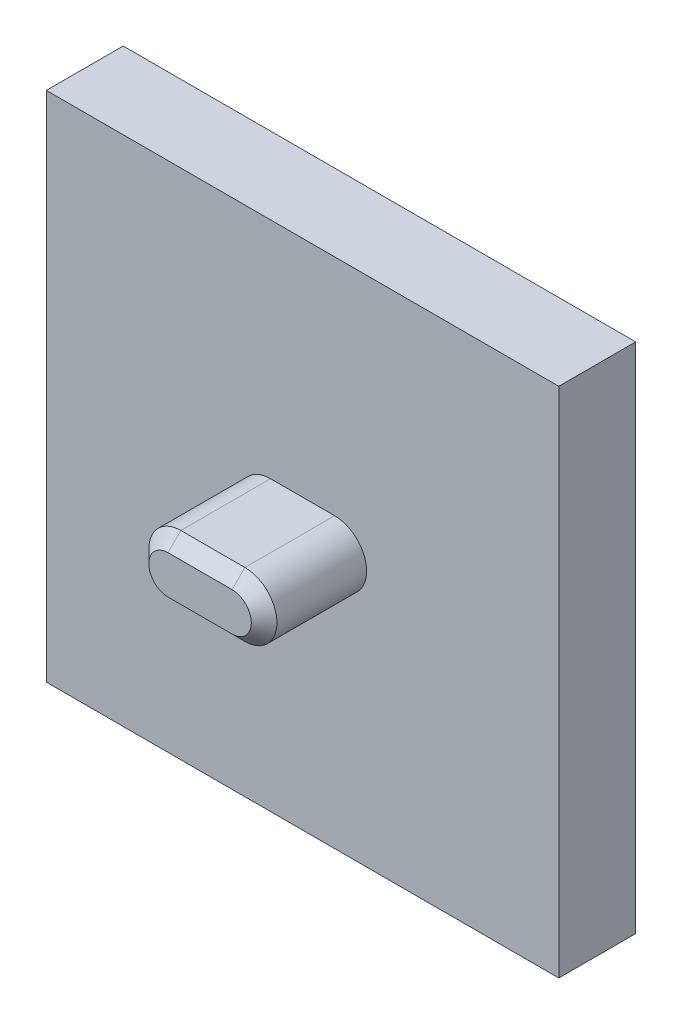
ISO-10303-21;
HEADER;
FILE_DESCRIPTION(('STEP AP214'),'2;1');
FILE_NAME('part.step','',(''),(''),'','','');
FILE_SCHEMA(('AUTOMOTIVE_DESIGN { 1 0 10303 214 1 1 1 1 }'));
ENDSEC;
DATA;
#1=APPLICATION_CONTEXT('core data for automotive mechanical design processes');
#2=APPLICATION_PROTOCOL_DEFINITION('international standard','automotive_design',2000,#1);
#3=PRODUCT_CONTEXT('',#1,'mechanical');
#4=PRODUCT('Part','Part','',(#3));
#5=PRODUCT_RELATED_PRODUCT_CATEGORY('part','',(#4));
#6=PRODUCT_DEFINITION_FORMATION('','',#4);
#7=PRODUCT_DEFINITION_CONTEXT('part definition',#1,'design');
#8=PRODUCT_DEFINITION('design','',#6,#7);
#9=PRODUCT_DEFINITION_SHAPE('','',#8);
#10=(LENGTH_UNIT() NAMED_UNIT(*) SI_UNIT(.MILLI.,.METRE.));
#11=(NAMED_UNIT(*) PLANE_ANGLE_UNIT() SI_UNIT($,.RADIAN.));
#12=(NAMED_UNIT(*) SI_UNIT($,.STERADIAN.) SOLID_ANGLE_UNIT());
#13=UNCERTAINTY_MEASURE_WITH_UNIT(LENGTH_MEASURE(1.E-05),#10,'distance_accuracy_value','');
#14=(GEOMETRIC_REPRESENTATION_CONTEXT(3) GLOBAL_UNCERTAINTY_ASSIGNED_CONTEXT((#13)) GLOBAL_UNIT_ASSIGNED_CONTEXT((#10,
#11,#12)) REPRESENTATION_CONTEXT('',''));
#15=CARTESIAN_POINT('',(0.,0.,0.));
#16=DIRECTION('',(0.,0.,1.));
#17=DIRECTION('',(1.,0.,0.));
#18=AXIS2_PLACEMENT_3D('',#15,#16,#17);
#19=CARTESIAN_POINT('',(10.,10.,0.));
#20=DIRECTION('',(0.,0.,1.));
#21=DIRECTION('',(1.,0.,0.));
#22=AXIS2_PLACEMENT_3D('',#19,#20,#21);
#23=PLANE('',#22);
#24=DIRECTION('',(0.,-1.,0.));
#25=VECTOR('',#24,1.);
#26=CARTESIAN_POINT('',(0.,20.,0.));
#27=LINE('',#26,#25);
#28=CARTESIAN_POINT('',(0.,20.,0.));
#29=VERTEX_POINT('',#28);
#30=CARTESIAN_POINT('',(0.,0.,0.));
#31=VERTEX_POINT('',#30);
#32=EDGE_CURVE('E24',#29,#31,#27,.T.);
#33=ORIENTED_EDGE('',*,*,#32,.F.);
#34=DIRECTION('',(-1.,0.,0.));
#35=VECTOR('',#34,1.);
#36=CARTESIAN_POINT('',(20.,20.,0.));
#37=LINE('',#36,#35);
#38=CARTESIAN_POINT('',(20.,20.,0.));
#39=VERTEX_POINT('',#38);
#40=EDGE_CURVE('E94',#39,#29,#37,.T.);
#41=ORIENTED_EDGE('',*,*,#40,.F.);
#42=DIRECTION('',(0.,1.,0.));
#43=VECTOR('',#42,1.);
#44=CARTESIAN_POINT('',(20.,0.,0.));
#45=LINE('',#44,#43);
#46=CARTESIAN_POINT('',(20.,0.,0.));
#47=VERTEX_POINT('',#46);
#48=EDGE_CURVE('E87',#47,#39,#45,.T.);
#49=ORIENTED_EDGE('',*,*,#48,.F.);
#50=DIRECTION('',(1.,0.,0.));
#51=VECTOR('',#50,1.);
#52=CARTESIAN_POINT('',(0.,0.,0.));
#53=LINE('',#52,#51);
#54=EDGE_CURVE('E71',#31,#47,#53,.T.);
#55=ORIENTED_EDGE('',*,*,#54,.F.);
#56=EDGE_LOOP('',(#33,#41,#49,#55));
#57=FACE_BOUND('',#56,.T.);
#58=ADVANCED_FACE('F16',(#57),#23,.F.);
#59=CARTESIAN_POINT('',(10.,10.,3.));
#60=DIRECTION('',(0.,0.,1.));
#61=DIRECTION('',(1.,0.,0.));
#62=AXIS2_PLACEMENT_3D('',#59,#60,#61);
#63=PLANE('',#62);
#64=DIRECTION('',(-0.9999999692097,0.0002481543853891,0.));
#65=VECTOR('',#64,1.);
#66=CARTESIAN_POINT('',(9.35500210703819,8.75047015768469,3.));
#67=LINE('',#66,#65);
#68=CARTESIAN_POINT('',(11.2496898070044,8.74999998260853,3.));
#69=VERTEX_POINT('',#68);
#70=CARTESIAN_POINT('',(8.71031433009622,8.75063013978868,3.));
#71=VERTEX_POINT('',#70);
#72=EDGE_CURVE('E138',#69,#71,#67,.T.);
#73=ORIENTED_EDGE('',*,*,#72,.T.);
#74=CARTESIAN_POINT('',(8.75,10.,3.));
#75=DIRECTION('',(0.,0.,-1.));
#76=DIRECTION('',(0.,1.,0.));
#77=AXIS2_PLACEMENT_3D('',#74,#75,#76);
#78=CIRCLE('',#77,1.25000000000004);
#79=CARTESIAN_POINT('',(8.75,11.25,3.));
#80=VERTEX_POINT('',#79);
#81=EDGE_CURVE('E148',#71,#80,#78,.T.);
#82=ORIENTED_EDGE('',*,*,#81,.T.);
#83=DIRECTION('',(1.,0.,0.));
#84=VECTOR('',#83,1.);
#85=CARTESIAN_POINT('',(10.625,11.25,3.));
#86=LINE('',#85,#84);
#87=CARTESIAN_POINT('',(11.25,11.2500000558793,3.));
#88=VERTEX_POINT('',#87);
#89=EDGE_CURVE('E147',#80,#88,#86,.T.);
#90=ORIENTED_EDGE('',*,*,#89,.T.);
#91=CARTESIAN_POINT('',(11.25,10.,3.));
#92=DIRECTION('',(0.,0.,-1.));
#93=DIRECTION('',(-0.000248154385392487,-0.9999999692097,0.));
#94=AXIS2_PLACEMENT_3D('',#91,#92,#93);
#95=CIRCLE('',#94,1.25000005587931);
#96=EDGE_CURVE('E128',#88,#69,#95,.T.);
#97=ORIENTED_EDGE('',*,*,#96,.T.);
#98=EDGE_LOOP('',(#73,#82,#90,#97));
#99=FACE_BOUND('',#98,.T.);
#100=DIRECTION('',(0.,-1.,0.));
#101=VECTOR('',#100,1.);
#102=CARTESIAN_POINT('',(0.,20.,3.));
#103=LINE('',#102,#101);
#104=CARTESIAN_POINT('',(0.,20.,3.));
#105=VERTEX_POINT('',#104);
#106=CARTESIAN_POINT('',(0.,0.,3.));
#107=VERTEX_POINT('',#106);
#108=EDGE_CURVE('E10',#105,#107,#103,.T.);
#109=ORIENTED_EDGE('',*,*,#108,.T.);
#110=DIRECTION('',(1.,0.,0.));
#111=VECTOR('',#110,1.);
#112=CARTESIAN_POINT('',(0.,0.,3.));
#113=LINE('',#112,#111);
#114=CARTESIAN_POINT('',(20.,0.,3.));
#115=VERTEX_POINT('',#114);
#116=EDGE_CURVE('E85',#107,#115,#113,.T.);
#117=ORIENTED_EDGE('',*,*,#116,.T.);
#118=DIRECTION('',(0.,1.,0.));
#119=VECTOR('',#118,1.);
#120=CARTESIAN_POINT('',(20.,0.,3.));
#121=LINE('',#120,#119);
#122=CARTESIAN_POINT('',(20.,20.,3.));
#123=VERTEX_POINT('',#122);
#124=EDGE_CURVE('E90',#115,#123,#121,.T.);
#125=ORIENTED_EDGE('',*,*,#124,.T.);
#126=DIRECTION('',(-1.,0.,0.));
#127=VECTOR('',#126,1.);
#128=CARTESIAN_POINT('',(20.,20.,3.));
#129=LINE('',#128,#127);
#130=EDGE_CURVE('E102',#123,#105,#129,.T.);
#131=ORIENTED_EDGE('',*,*,#130,.T.);
#132=EDGE_LOOP('',(#109,#117,#125,#131));
#133=FACE_BOUND('',#132,.T.);
#134=ADVANCED_FACE('F353',(#99,#133),#63,.T.);
#135=CARTESIAN_POINT('',(0.,20.,0.));
#136=DIRECTION('',(-1.,0.,0.));
#137=DIRECTION('',(0.,0.,1.));
#138=AXIS2_PLACEMENT_3D('',#135,#136,#137);
#139=PLANE('',#138);
#140=ORIENTED_EDGE('',*,*,#32,.T.);
#141=DIRECTION('',(0.,0.,1.));
#142=VECTOR('',#141,1.);
#143=CARTESIAN_POINT('',(0.,0.,0.));
#144=LINE('',#143,#142);
#145=EDGE_CURVE('E77',#31,#107,#144,.T.);
#146=ORIENTED_EDGE('',*,*,#145,.T.);
#147=ORIENTED_EDGE('',*,*,#108,.F.);
#148=DIRECTION('',(0.,0.,1.));
#149=VECTOR('',#148,1.);
#150=CARTESIAN_POINT('',(0.,20.,0.));
#151=LINE('',#150,#149);
#152=EDGE_CURVE('E156',#29,#105,#151,.T.);
#153=ORIENTED_EDGE('',*,*,#152,.F.);
#154=EDGE_LOOP('',(#140,#146,#147,#153));
#155=FACE_BOUND('',#154,.T.);
#156=ADVANCED_FACE('F389',(#155),#139,.T.);
#157=CARTESIAN_POINT('',(0.,0.,0.));
#158=DIRECTION('',(0.,-1.,0.));
#159=DIRECTION('',(0.,0.,-1.));
#160=AXIS2_PLACEMENT_3D('',#157,#158,#159);
#161=PLANE('',#160);
#162=ORIENTED_EDGE('',*,*,#54,.T.);
#163=DIRECTION('',(0.,0.,1.));
#164=VECTOR('',#163,1.);
#165=CARTESIAN_POINT('',(20.,0.,0.));
#166=LINE('',#165,#164);
#167=EDGE_CURVE('E76',#47,#115,#166,.T.);
#168=ORIENTED_EDGE('',*,*,#167,.T.);
#169=ORIENTED_EDGE('',*,*,#116,.F.);
#170=ORIENTED_EDGE('',*,*,#145,.F.);
#171=EDGE_LOOP('',(#162,#168,#169,#170));
#172=FACE_BOUND('',#171,.T.);
#173=ADVANCED_FACE('F72',(#172),#161,.T.);
#174=CARTESIAN_POINT('',(20.,0.,0.));
#175=DIRECTION('',(1.,0.,0.));
#176=DIRECTION('',(0.,1.,0.));
#177=AXIS2_PLACEMENT_3D('',#174,#175,#176);
#178=PLANE('',#177);
#179=ORIENTED_EDGE('',*,*,#48,.T.);
#180=DIRECTION('',(0.,0.,1.));
#181=VECTOR('',#180,1.);
#182=CARTESIAN_POINT('',(20.,20.,0.));
#183=LINE('',#182,#181);
#184=EDGE_CURVE('E96',#39,#123,#183,.T.);
#185=ORIENTED_EDGE('',*,*,#184,.T.);
#186=ORIENTED_EDGE('',*,*,#124,.F.);
#187=ORIENTED_EDGE('',*,*,#167,.F.);
#188=EDGE_LOOP('',(#179,#185,#186,#187));
#189=FACE_BOUND('',#188,.T.);
#190=ADVANCED_FACE('F84',(#189),#178,.T.);
#191=CARTESIAN_POINT('',(20.,20.,0.));
#192=DIRECTION('',(0.,1.,0.));
#193=DIRECTION('',(1.,0.,0.));
#194=AXIS2_PLACEMENT_3D('',#191,#192,#193);
#195=PLANE('',#194);
#196=ORIENTED_EDGE('',*,*,#40,.T.);
#197=ORIENTED_EDGE('',*,*,#152,.T.);
#198=ORIENTED_EDGE('',*,*,#130,.F.);
#199=ORIENTED_EDGE('',*,*,#184,.F.);
#200=EDGE_LOOP('',(#196,#197,#198,#199));
#201=FACE_BOUND('',#200,.T.);
#202=ADVANCED_FACE('F414',(#201),#195,.T.);
#203=CARTESIAN_POINT('',(11.25,11.25,3.));
#204=DIRECTION('',(0.,1.,0.));
#205=DIRECTION('',(1.,0.,0.));
#206=AXIS2_PLACEMENT_3D('',#203,#204,#205);
#207=PLANE('',#206);
#208=DIRECTION('',(-1.,0.,0.));
#209=VECTOR('',#208,1.);
#210=CARTESIAN_POINT('',(10.6250000139698,11.25,6.5));
#211=LINE('',#210,#209);
#212=CARTESIAN_POINT('',(11.25,11.2500000558793,6.5));
#213=VERTEX_POINT('',#212);
#214=CARTESIAN_POINT('',(8.75,11.25,6.5));
#215=VERTEX_POINT('',#214);
#216=EDGE_CURVE('E120',#213,#215,#211,.T.);
#217=ORIENTED_EDGE('',*,*,#216,.F.);
#218=DIRECTION('',(0.,0.,1.));
#219=VECTOR('',#218,1.);
#220=CARTESIAN_POINT('',(11.25,11.2500000558793,3.));
#221=LINE('',#220,#219);
#222=EDGE_CURVE('E132',#88,#213,#221,.T.);
#223=ORIENTED_EDGE('',*,*,#222,.F.);
#224=ORIENTED_EDGE('',*,*,#89,.F.);
#225=DIRECTION('',(0.,0.,1.));
#226=VECTOR('',#225,1.);
#227=CARTESIAN_POINT('',(8.75,11.25,3.));
#228=LINE('',#227,#226);
#229=EDGE_CURVE('E142',#80,#215,#228,.T.);
#230=ORIENTED_EDGE('',*,*,#229,.T.);
#231=EDGE_LOOP('',(#217,#223,#224,#230));
#232=FACE_BOUND('',#231,.T.);
#233=ADVANCED_FACE('F422',(#232),#207,.T.);
#234=CARTESIAN_POINT('',(8.75,10.,3.));
#235=DIRECTION('',(0.,0.,1.));
#236=DIRECTION('',(0.,1.,0.));
#237=AXIS2_PLACEMENT_3D('',#234,#235,#236);
#238=CYLINDRICAL_SURFACE('',#237,1.25000000000004);
#239=CARTESIAN_POINT('',(8.75,10.,6.5));
#240=DIRECTION('',(0.,0.,1.));
#241=DIRECTION('',(0.,1.,0.));
#242=AXIS2_PLACEMENT_3D('',#239,#240,#241);
#243=CIRCLE('',#242,1.25000000000004);
#244=CARTESIAN_POINT('',(8.71031433009622,8.75063013978868,6.5));
#245=VERTEX_POINT('',#244);
#246=EDGE_CURVE('E127',#215,#245,#243,.T.);
#247=ORIENTED_EDGE('',*,*,#246,.F.);
#248=ORIENTED_EDGE('',*,*,#229,.F.);
#249=ORIENTED_EDGE('',*,*,#81,.F.);
#250=DIRECTION('',(0.,0.,1.));
#251=VECTOR('',#250,1.);
#252=CARTESIAN_POINT('',(8.71031433009622,8.75063013978868,3.));
#253=LINE('',#252,#251);
#254=EDGE_CURVE('E133',#71,#245,#253,.T.);
#255=ORIENTED_EDGE('',*,*,#254,.T.);
#256=EDGE_LOOP('',(#247,#248,#249,#255));
#257=FACE_BOUND('',#256,.T.);
#258=ADVANCED_FACE('F355',(#257),#238,.T.);
#259=CARTESIAN_POINT('',(10.0000000279396,10.,7.));
#260=DIRECTION('',(0.,0.,1.));
#261=DIRECTION('',(1.,0.,0.));
#262=AXIS2_PLACEMENT_3D('',#259,#260,#261);
#263=PLANE('',#262);
#264=DIRECTION('',(-0.9999999692097,0.0002481543853891,0.));
#265=VECTOR('',#264,1.);
#266=CARTESIAN_POINT('',(9.3551261982007,9.25047014228607,7.));
#267=LINE('',#266,#265);
#268=CARTESIAN_POINT('',(11.2498138841971,9.24999996721338,7.));
#269=VERTEX_POINT('',#268);
#270=CARTESIAN_POINT('',(8.71931632906088,9.25062792129823,7.));
#271=VERTEX_POINT('',#270);
#272=EDGE_CURVE('E259',#269,#271,#267,.T.);
#273=ORIENTED_EDGE('',*,*,#272,.F.);
#274=CARTESIAN_POINT('',(11.25,10.,7.));
#275=DIRECTION('',(0.,0.,-1.));
#276=DIRECTION('',(0.000248154385392487,0.9999999692097,0.));
#277=AXIS2_PLACEMENT_3D('',#274,#275,#276);
#278=CIRCLE('',#277,0.750000055879315);
#279=CARTESIAN_POINT('',(11.25,10.7500000558793,7.));
#280=VERTEX_POINT('',#279);
#281=EDGE_CURVE('E109',#280,#269,#278,.T.);
#282=ORIENTED_EDGE('',*,*,#281,.F.);
#283=DIRECTION('',(1.,0.,0.));
#284=VECTOR('',#283,1.);
#285=CARTESIAN_POINT('',(10.6250000139698,10.75,7.));
#286=LINE('',#285,#284);
#287=CARTESIAN_POINT('',(8.75,10.75,7.));
#288=VERTEX_POINT('',#287);
#289=EDGE_CURVE('E116',#288,#280,#286,.T.);
#290=ORIENTED_EDGE('',*,*,#289,.F.);
#291=CARTESIAN_POINT('',(8.75,10.,7.));
#292=DIRECTION('',(0.,0.,-1.));
#293=DIRECTION('',(0.,1.,0.));
#294=AXIS2_PLACEMENT_3D('',#291,#292,#293);
#295=CIRCLE('',#294,0.750000000000036);
#296=EDGE_CURVE('E252',#271,#288,#295,.T.);
#297=ORIENTED_EDGE('',*,*,#296,.F.);
#298=EDGE_LOOP('',(#273,#282,#290,#297));
#299=FACE_BOUND('',#298,.T.);
#300=ADVANCED_FACE('F327',(#299),#263,.T.);
#301=CARTESIAN_POINT('',(8.71031433009622,8.75063013978867,3.));
#302=DIRECTION('',(-0.0002481543853891,-0.9999999692097,0.));
#303=DIRECTION('',(-0.9999999692097,0.0002481543853891,0.));
#304=AXIS2_PLACEMENT_3D('',#301,#302,#303);
#305=PLANE('',#304);
#306=DIRECTION('',(0.9999999692097,-0.0002481543853891,0.));
#307=VECTOR('',#306,1.);
#308=CARTESIAN_POINT('',(9.35500212100801,8.75047015768123,6.5));
#309=LINE('',#308,#307);
#310=CARTESIAN_POINT('',(11.2496898070044,8.74999998260853,6.5));
#311=VERTEX_POINT('',#310);
#312=EDGE_CURVE('E279',#245,#311,#309,.T.);
#313=ORIENTED_EDGE('',*,*,#312,.F.);
#314=ORIENTED_EDGE('',*,*,#254,.F.);
#315=ORIENTED_EDGE('',*,*,#72,.F.);
#316=DIRECTION('',(0.,0.,1.));
#317=VECTOR('',#316,1.);
#318=CARTESIAN_POINT('',(11.2496898070044,8.74999998260853,3.));
#319=LINE('',#318,#317);
#320=EDGE_CURVE('E122',#69,#311,#319,.T.);
#321=ORIENTED_EDGE('',*,*,#320,.T.);
#322=EDGE_LOOP('',(#313,#314,#315,#321));
#323=FACE_BOUND('',#322,.T.);
#324=ADVANCED_FACE('F357',(#323),#305,.T.);
#325=CARTESIAN_POINT('',(11.25,10.,3.));
#326=DIRECTION('',(0.,0.,1.));
#327=DIRECTION('',(0.999999992302425,-0.000124077193636327,0.));
#328=AXIS2_PLACEMENT_3D('',#325,#326,#327);
#329=CYLINDRICAL_SURFACE('',#328,1.25000005587932);
#330=CARTESIAN_POINT('',(11.25,10.,6.5));
#331=DIRECTION('',(0.,0.,1.));
#332=DIRECTION('',(0.000248154385392487,0.9999999692097,0.));
#333=AXIS2_PLACEMENT_3D('',#330,#331,#332);
#334=CIRCLE('',#333,1.25000005587931);
#335=EDGE_CURVE('E111',#311,#213,#334,.T.);
#336=ORIENTED_EDGE('',*,*,#335,.F.);
#337=ORIENTED_EDGE('',*,*,#320,.F.);
#338=ORIENTED_EDGE('',*,*,#96,.F.);
#339=ORIENTED_EDGE('',*,*,#222,.T.);
#340=EDGE_LOOP('',(#336,#337,#338,#339));
#341=FACE_BOUND('',#340,.T.);
#342=ADVANCED_FACE('F447',(#341),#329,.T.);
#343=CARTESIAN_POINT('',(8.75,10.,6.75));
#344=DIRECTION('',(0.,0.,-1.));
#345=DIRECTION('',(0.,1.,0.));
#346=AXIS2_PLACEMENT_3D('',#343,#344,#345);
#347=CONICAL_SURFACE('',#346,1.00000000000004,0.785398163397448);
#348=ORIENTED_EDGE('',*,*,#296,.T.);
#349=DIRECTION('',(0.,-0.707106781186548,0.707106781186548));
#350=VECTOR('',#349,1.);
#351=CARTESIAN_POINT('',(8.75,11.25,6.5));
#352=LINE('',#351,#350);
#353=EDGE_CURVE('E107',#215,#288,#352,.T.);
#354=ORIENTED_EDGE('',*,*,#353,.F.);
#355=ORIENTED_EDGE('',*,*,#246,.T.);
#356=CARTESIAN_POINT('',(8.71931632906089,9.25062792129823,7.));
#357=CARTESIAN_POINT('',(8.71595283061808,9.08725991300535,6.83663116207038));
#358=CARTESIAN_POINT('',(8.71292486966906,8.91376460810326,6.66313511110847));
#359=CARTESIAN_POINT('',(8.71031433009627,8.75063013978867,6.5));
#360=(BOUNDED_CURVE() B_SPLINE_CURVE(3,(#356,#357,#358,#359),.UNSPECIFIED.,.F.,
.F.) B_SPLINE_CURVE_WITH_KNOTS((4,4),(0.,0.0693186964791229),
.UNSPECIFIED.) CURVE() GEOMETRIC_REPRESENTATION_ITEM() RATIONAL_B_SPLINE_CURVE((1.,1.,1.,1.)) REPRESENTATION_ITEM(''));
#361=EDGE_CURVE('E246',#271,#245,#360,.T.);
#362=ORIENTED_EDGE('',*,*,#361,.F.);
#363=EDGE_LOOP('',(#348,#354,#355,#362));
#364=FACE_BOUND('',#363,.T.);
#365=ADVANCED_FACE('F312',(#364),#347,.T.);
#366=CARTESIAN_POINT('',(10.6250000139698,11.,6.75));
#367=DIRECTION('',(0.,0.707106781186548,0.707106781186548));
#368=DIRECTION('',(1.,0.,0.));
#369=AXIS2_PLACEMENT_3D('',#366,#367,#368);
#370=PLANE('',#369);
#371=ORIENTED_EDGE('',*,*,#353,.T.);
#372=ORIENTED_EDGE('',*,*,#289,.T.);
#373=DIRECTION('',(0.,-0.707106781186546,0.707106781186549));
#374=VECTOR('',#373,1.);
#375=CARTESIAN_POINT('',(11.25,11.2500000558793,6.5));
#376=LINE('',#375,#374);
#377=EDGE_CURVE('E113',#213,#280,#376,.T.);
#378=ORIENTED_EDGE('',*,*,#377,.F.);
#379=ORIENTED_EDGE('',*,*,#216,.T.);
#380=EDGE_LOOP('',(#371,#372,#378,#379));
#381=FACE_BOUND('',#380,.T.);
#382=ADVANCED_FACE('F308',(#381),#370,.T.);
#383=CARTESIAN_POINT('',(11.25,10.,6.75));
#384=DIRECTION('',(0.,0.,-1.));
#385=DIRECTION('',(0.000248154385392487,0.9999999692097,0.));
#386=AXIS2_PLACEMENT_3D('',#383,#384,#385);
#387=CONICAL_SURFACE('',#386,1.00000005587931,0.785398163397448);
#388=ORIENTED_EDGE('',*,*,#377,.T.);
#389=ORIENTED_EDGE('',*,*,#281,.T.);
#390=DIRECTION('',(0.000175471648691586,0.707106759414516,0.707106781186549));
#391=VECTOR('',#390,1.);
#392=CARTESIAN_POINT('',(11.2496898070044,8.74999998260853,6.5));
#393=LINE('',#392,#391);
#394=EDGE_CURVE('E266',#311,#269,#393,.T.);
#395=ORIENTED_EDGE('',*,*,#394,.F.);
#396=ORIENTED_EDGE('',*,*,#335,.T.);
#397=EDGE_LOOP('',(#388,#389,#395,#396));
#398=FACE_BOUND('',#397,.T.);
#399=ADVANCED_FACE('F482',(#398),#387,.T.);
#400=CARTESIAN_POINT('',(9.35506415960435,9.00047014998365,6.75));
#401=DIRECTION('',(-0.000175471648689813,-0.707106759414519,0.707106781186546));
#402=DIRECTION('',(-0.9999999692097,0.0002481543853891,0.));
#403=AXIS2_PLACEMENT_3D('',#400,#401,#402);
#404=PLANE('',#403);
#405=ORIENTED_EDGE('',*,*,#312,.T.);
#406=ORIENTED_EDGE('',*,*,#394,.T.);
#407=ORIENTED_EDGE('',*,*,#272,.T.);
#408=ORIENTED_EDGE('',*,*,#361,.T.);
#409=EDGE_LOOP('',(#405,#406,#407,#408));
#410=FACE_BOUND('',#409,.T.);
#411=ADVANCED_FACE('F364',(#410),#404,.T.);
#412=CLOSED_SHELL('',(#58,#134,#156,#173,#190,#202,#233,#258,#300,#324,#342,#365,#382,#399,#411));
#413=MANIFOLD_SOLID_BREP('B1',#412);
#414=ADVANCED_BREP_SHAPE_REPRESENTATION('',(#18,#413),#14);
#415=SHAPE_DEFINITION_REPRESENTATION(#9,#414);
ENDSEC;
END-ISO-10303-21;
